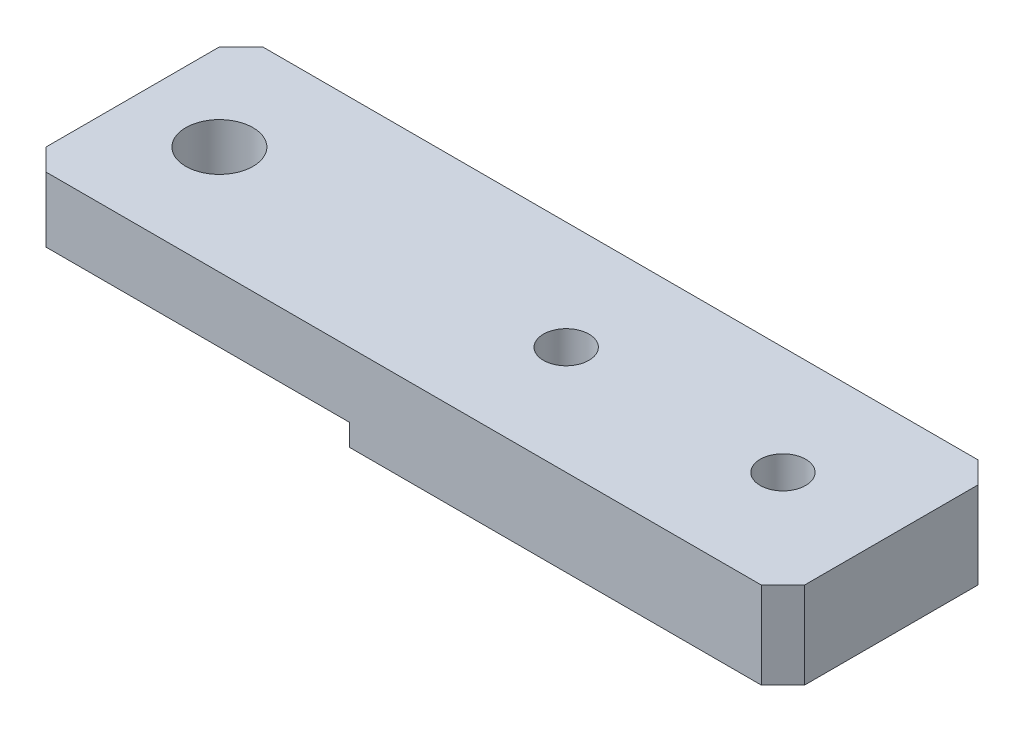
ISO-10303-21;
HEADER;
FILE_DESCRIPTION(('STEP AP214'),'2;1');
FILE_NAME('part.step','',(''),(''),'','','');
FILE_SCHEMA(('AUTOMOTIVE_DESIGN { 1 0 10303 214 1 1 1 1 }'));
ENDSEC;
DATA;
#1=APPLICATION_CONTEXT('core data for automotive mechanical design processes');
#2=APPLICATION_PROTOCOL_DEFINITION('international standard','automotive_design',2000,#1);
#3=PRODUCT_CONTEXT('',#1,'mechanical');
#4=PRODUCT('Part','Part','',(#3));
#5=PRODUCT_RELATED_PRODUCT_CATEGORY('part','',(#4));
#6=PRODUCT_DEFINITION_FORMATION('','',#4);
#7=PRODUCT_DEFINITION_CONTEXT('part definition',#1,'design');
#8=PRODUCT_DEFINITION('design','',#6,#7);
#9=PRODUCT_DEFINITION_SHAPE('','',#8);
#10=(LENGTH_UNIT() NAMED_UNIT(*) SI_UNIT(.MILLI.,.METRE.));
#11=(NAMED_UNIT(*) PLANE_ANGLE_UNIT() SI_UNIT($,.RADIAN.));
#12=(NAMED_UNIT(*) SI_UNIT($,.STERADIAN.) SOLID_ANGLE_UNIT());
#13=UNCERTAINTY_MEASURE_WITH_UNIT(LENGTH_MEASURE(1.E-05),#10,'distance_accuracy_value','');
#14=(GEOMETRIC_REPRESENTATION_CONTEXT(3) GLOBAL_UNCERTAINTY_ASSIGNED_CONTEXT((#13)) GLOBAL_UNIT_ASSIGNED_CONTEXT((#10,
#11,#12)) REPRESENTATION_CONTEXT('',''));
#15=CARTESIAN_POINT('',(0.,0.,0.));
#16=DIRECTION('',(0.,0.,1.));
#17=DIRECTION('',(1.,0.,0.));
#18=AXIS2_PLACEMENT_3D('',#15,#16,#17);
#19=CARTESIAN_POINT('',(0.,10.,10.));
#20=DIRECTION('',(0.,-1.,0.));
#21=DIRECTION('',(1.,0.,0.));
#22=AXIS2_PLACEMENT_3D('',#19,#20,#21);
#23=PLANE('',#22);
#24=CARTESIAN_POINT('',(8.,10.,0.));
#25=DIRECTION('',(0.,-1.,0.));
#26=DIRECTION('',(1.,0.,0.));
#27=AXIS2_PLACEMENT_3D('',#24,#25,#26);
#28=CIRCLE('',#27,3.1);
#29=CARTESIAN_POINT('',(11.1,10.,0.));
#30=VERTEX_POINT('',#29);
#31=EDGE_CURVE('E321',#30,#30,#28,.T.);
#32=ORIENTED_EDGE('',*,*,#31,.T.);
#33=EDGE_LOOP('',(#32));
#34=FACE_BOUND('',#33,.T.);
#35=CARTESIAN_POINT('',(60.,10.,0.));
#36=DIRECTION('',(0.,-1.,0.));
#37=DIRECTION('',(1.,0.,0.));
#38=AXIS2_PLACEMENT_3D('',#35,#36,#37);
#39=CIRCLE('',#38,2.1);
#40=CARTESIAN_POINT('',(62.1,10.,0.));
#41=VERTEX_POINT('',#40);
#42=EDGE_CURVE('E313',#41,#41,#39,.T.);
#43=ORIENTED_EDGE('',*,*,#42,.T.);
#44=EDGE_LOOP('',(#43));
#45=FACE_BOUND('',#44,.T.);
#46=CARTESIAN_POINT('',(40.,10.,0.));
#47=DIRECTION('',(0.,-1.,0.));
#48=DIRECTION('',(1.,0.,0.));
#49=AXIS2_PLACEMENT_3D('',#46,#47,#48);
#50=CIRCLE('',#49,2.1);
#51=CARTESIAN_POINT('',(42.1,10.,0.));
#52=VERTEX_POINT('',#51);
#53=EDGE_CURVE('E308',#52,#52,#50,.T.);
#54=ORIENTED_EDGE('',*,*,#53,.T.);
#55=EDGE_LOOP('',(#54));
#56=FACE_BOUND('',#55,.T.);
#57=DIRECTION('',(0.,0.,-1.));
#58=VECTOR('',#57,1.);
#59=CARTESIAN_POINT('',(70.,10.,10.));
#60=LINE('',#59,#58);
#61=CARTESIAN_POINT('',(70.,10.,7.99999999999999));
#62=VERTEX_POINT('',#61);
#63=CARTESIAN_POINT('',(70.,10.,-8.00000000000001));
#64=VERTEX_POINT('',#63);
#65=EDGE_CURVE('E153',#62,#64,#60,.T.);
#66=ORIENTED_EDGE('',*,*,#65,.T.);
#67=DIRECTION('',(-0.70710678118655,0.,-0.707106781186545));
#68=VECTOR('',#67,1.);
#69=CARTESIAN_POINT('',(70.,10.,-8.00000000000001));
#70=LINE('',#69,#68);
#71=CARTESIAN_POINT('',(68.,10.,-10.));
#72=VERTEX_POINT('',#71);
#73=EDGE_CURVE('E220',#64,#72,#70,.T.);
#74=ORIENTED_EDGE('',*,*,#73,.T.);
#75=DIRECTION('',(-1.,0.,0.));
#76=VECTOR('',#75,1.);
#77=CARTESIAN_POINT('',(0.,10.,-10.));
#78=LINE('',#77,#76);
#79=CARTESIAN_POINT('',(2.,10.,-10.));
#80=VERTEX_POINT('',#79);
#81=EDGE_CURVE('E157',#72,#80,#78,.T.);
#82=ORIENTED_EDGE('',*,*,#81,.T.);
#83=DIRECTION('',(-0.70710678118655,0.,0.707106781186545));
#84=VECTOR('',#83,1.);
#85=CARTESIAN_POINT('',(0.,10.,-8.00000000000001));
#86=LINE('',#85,#84);
#87=CARTESIAN_POINT('',(0.,10.,-8.00000000000001));
#88=VERTEX_POINT('',#87);
#89=EDGE_CURVE('E205',#80,#88,#86,.T.);
#90=ORIENTED_EDGE('',*,*,#89,.T.);
#91=DIRECTION('',(0.,0.,-1.));
#92=VECTOR('',#91,1.);
#93=CARTESIAN_POINT('',(0.,10.,10.));
#94=LINE('',#93,#92);
#95=CARTESIAN_POINT('',(0.,10.,8.));
#96=VERTEX_POINT('',#95);
#97=EDGE_CURVE('E180',#96,#88,#94,.T.);
#98=ORIENTED_EDGE('',*,*,#97,.F.);
#99=DIRECTION('',(-0.707106781186545,0.,-0.70710678118655));
#100=VECTOR('',#99,1.);
#101=CARTESIAN_POINT('',(1.99999999999999,10.,10.));
#102=LINE('',#101,#100);
#103=CARTESIAN_POINT('',(1.99999999999999,10.,10.));
#104=VERTEX_POINT('',#103);
#105=EDGE_CURVE('E201',#96,#104,#102,.F.);
#106=ORIENTED_EDGE('',*,*,#105,.T.);
#107=DIRECTION('',(-1.,0.,0.));
#108=VECTOR('',#107,1.);
#109=CARTESIAN_POINT('',(0.,10.,10.));
#110=LINE('',#109,#108);
#111=CARTESIAN_POINT('',(68.,10.,10.));
#112=VERTEX_POINT('',#111);
#113=EDGE_CURVE('E133',#112,#104,#110,.T.);
#114=ORIENTED_EDGE('',*,*,#113,.F.);
#115=DIRECTION('',(-0.707106781186546,0.,0.707106781186549));
#116=VECTOR('',#115,1.);
#117=CARTESIAN_POINT('',(68.,10.,10.));
#118=LINE('',#117,#116);
#119=EDGE_CURVE('E217',#112,#62,#118,.F.);
#120=ORIENTED_EDGE('',*,*,#119,.T.);
#121=EDGE_LOOP('',(#66,#74,#82,#90,#98,#106,#114,#120));
#122=FACE_BOUND('',#121,.T.);
#123=ADVANCED_FACE('F41',(#34,#45,#56,#122),#23,.F.);
#124=CARTESIAN_POINT('',(0.,4.,10.));
#125=DIRECTION('',(1.,0.,0.));
#126=DIRECTION('',(0.,1.,0.));
#127=AXIS2_PLACEMENT_3D('',#124,#125,#126);
#128=PLANE('',#127);
#129=ORIENTED_EDGE('',*,*,#97,.T.);
#130=DIRECTION('',(0.,-1.,0.));
#131=VECTOR('',#130,1.);
#132=CARTESIAN_POINT('',(0.,4.,-8.00000000000001));
#133=LINE('',#132,#131);
#134=CARTESIAN_POINT('',(0.,4.,-8.00000000000001));
#135=VERTEX_POINT('',#134);
#136=EDGE_CURVE('E187',#88,#135,#133,.T.);
#137=ORIENTED_EDGE('',*,*,#136,.T.);
#138=DIRECTION('',(0.,0.,-1.));
#139=VECTOR('',#138,1.);
#140=CARTESIAN_POINT('',(0.,4.,10.));
#141=LINE('',#140,#139);
#142=CARTESIAN_POINT('',(0.,4.,8.));
#143=VERTEX_POINT('',#142);
#144=EDGE_CURVE('E144',#143,#135,#141,.T.);
#145=ORIENTED_EDGE('',*,*,#144,.F.);
#146=DIRECTION('',(0.,1.,0.));
#147=VECTOR('',#146,1.);
#148=CARTESIAN_POINT('',(0.,4.,8.));
#149=LINE('',#148,#147);
#150=EDGE_CURVE('E184',#143,#96,#149,.T.);
#151=ORIENTED_EDGE('',*,*,#150,.T.);
#152=EDGE_LOOP('',(#129,#137,#145,#151));
#153=FACE_BOUND('',#152,.T.);
#154=ADVANCED_FACE('F251',(#153),#128,.F.);
#155=CARTESIAN_POINT('',(0.,4.,10.));
#156=DIRECTION('',(0.,1.,0.));
#157=DIRECTION('',(0.,0.,1.));
#158=AXIS2_PLACEMENT_3D('',#155,#156,#157);
#159=PLANE('',#158);
#160=CARTESIAN_POINT('',(8.,4.,0.));
#161=DIRECTION('',(0.,1.,0.));
#162=DIRECTION('',(0.,0.,1.));
#163=AXIS2_PLACEMENT_3D('',#160,#161,#162);
#164=CIRCLE('',#163,6.);
#165=CARTESIAN_POINT('',(8.,4.,6.));
#166=VERTEX_POINT('',#165);
#167=EDGE_CURVE('E11',#166,#166,#164,.T.);
#168=ORIENTED_EDGE('',*,*,#167,.T.);
#169=EDGE_LOOP('',(#168));
#170=FACE_BOUND('',#169,.T.);
#171=ORIENTED_EDGE('',*,*,#144,.T.);
#172=DIRECTION('',(0.70710678118655,0.,-0.707106781186545));
#173=VECTOR('',#172,1.);
#174=CARTESIAN_POINT('',(0.,4.,-8.00000000000001));
#175=LINE('',#174,#173);
#176=CARTESIAN_POINT('',(2.,4.,-10.));
#177=VERTEX_POINT('',#176);
#178=EDGE_CURVE('E194',#135,#177,#175,.T.);
#179=ORIENTED_EDGE('',*,*,#178,.T.);
#180=DIRECTION('',(1.,0.,0.));
#181=VECTOR('',#180,1.);
#182=CARTESIAN_POINT('',(0.,4.,-10.));
#183=LINE('',#182,#181);
#184=CARTESIAN_POINT('',(30.,4.,-10.));
#185=VERTEX_POINT('',#184);
#186=EDGE_CURVE('E140',#177,#185,#183,.T.);
#187=ORIENTED_EDGE('',*,*,#186,.T.);
#188=DIRECTION('',(0.,0.,-1.));
#189=VECTOR('',#188,1.);
#190=CARTESIAN_POINT('',(30.,4.,10.));
#191=LINE('',#190,#189);
#192=CARTESIAN_POINT('',(30.,4.,10.));
#193=VERTEX_POINT('',#192);
#194=EDGE_CURVE('E136',#193,#185,#191,.T.);
#195=ORIENTED_EDGE('',*,*,#194,.F.);
#196=DIRECTION('',(1.,0.,0.));
#197=VECTOR('',#196,1.);
#198=CARTESIAN_POINT('',(0.,4.,10.));
#199=LINE('',#198,#197);
#200=CARTESIAN_POINT('',(1.99999999999999,4.,10.));
#201=VERTEX_POINT('',#200);
#202=EDGE_CURVE('E123',#201,#193,#199,.T.);
#203=ORIENTED_EDGE('',*,*,#202,.F.);
#204=DIRECTION('',(0.707106781186545,0.,0.70710678118655));
#205=VECTOR('',#204,1.);
#206=CARTESIAN_POINT('',(1.99999999999999,4.,10.));
#207=LINE('',#206,#205);
#208=EDGE_CURVE('E191',#201,#143,#207,.F.);
#209=ORIENTED_EDGE('',*,*,#208,.T.);
#210=EDGE_LOOP('',(#171,#179,#187,#195,#203,#209));
#211=FACE_BOUND('',#210,.T.);
#212=ADVANCED_FACE('F138',(#170,#211),#159,.F.);
#213=CARTESIAN_POINT('',(30.,4.,10.));
#214=DIRECTION('',(1.,0.,0.));
#215=DIRECTION('',(0.,0.,-1.));
#216=AXIS2_PLACEMENT_3D('',#213,#214,#215);
#217=PLANE('',#216);
#218=DIRECTION('',(0.,-1.,0.));
#219=VECTOR('',#218,1.);
#220=CARTESIAN_POINT('',(30.,4.,-10.));
#221=LINE('',#220,#219);
#222=CARTESIAN_POINT('',(30.,2.,-10.));
#223=VERTEX_POINT('',#222);
#224=EDGE_CURVE('E163',#185,#223,#221,.T.);
#225=ORIENTED_EDGE('',*,*,#224,.T.);
#226=DIRECTION('',(0.,0.,-1.));
#227=VECTOR('',#226,1.);
#228=CARTESIAN_POINT('',(30.,2.,10.));
#229=LINE('',#228,#227);
#230=CARTESIAN_POINT('',(30.,2.,10.));
#231=VERTEX_POINT('',#230);
#232=EDGE_CURVE('E145',#231,#223,#229,.T.);
#233=ORIENTED_EDGE('',*,*,#232,.F.);
#234=DIRECTION('',(0.,-1.,0.));
#235=VECTOR('',#234,1.);
#236=CARTESIAN_POINT('',(30.,4.,10.));
#237=LINE('',#236,#235);
#238=EDGE_CURVE('E127',#193,#231,#237,.T.);
#239=ORIENTED_EDGE('',*,*,#238,.F.);
#240=ORIENTED_EDGE('',*,*,#194,.T.);
#241=EDGE_LOOP('',(#225,#233,#239,#240));
#242=FACE_BOUND('',#241,.T.);
#243=ADVANCED_FACE('F147',(#242),#217,.F.);
#244=CARTESIAN_POINT('',(70.,2.,10.));
#245=DIRECTION('',(0.,1.,0.));
#246=DIRECTION('',(-1.,0.,0.));
#247=AXIS2_PLACEMENT_3D('',#244,#245,#246);
#248=PLANE('',#247);
#249=CARTESIAN_POINT('',(60.,2.,0.));
#250=DIRECTION('',(0.,-1.,0.));
#251=DIRECTION('',(1.,0.,0.));
#252=AXIS2_PLACEMENT_3D('',#249,#250,#251);
#253=CIRCLE('',#252,2.1);
#254=CARTESIAN_POINT('',(62.1,2.,0.));
#255=VERTEX_POINT('',#254);
#256=EDGE_CURVE('E324',#255,#255,#253,.T.);
#257=ORIENTED_EDGE('',*,*,#256,.F.);
#258=EDGE_LOOP('',(#257));
#259=FACE_BOUND('',#258,.T.);
#260=CARTESIAN_POINT('',(40.,2.,0.));
#261=DIRECTION('',(0.,-1.,0.));
#262=DIRECTION('',(1.,0.,0.));
#263=AXIS2_PLACEMENT_3D('',#260,#261,#262);
#264=CIRCLE('',#263,2.1);
#265=CARTESIAN_POINT('',(42.1,2.,0.));
#266=VERTEX_POINT('',#265);
#267=EDGE_CURVE('E309',#266,#266,#264,.T.);
#268=ORIENTED_EDGE('',*,*,#267,.F.);
#269=EDGE_LOOP('',(#268));
#270=FACE_BOUND('',#269,.T.);
#271=DIRECTION('',(1.,0.,0.));
#272=VECTOR('',#271,1.);
#273=CARTESIAN_POINT('',(70.,2.,-10.));
#274=LINE('',#273,#272);
#275=CARTESIAN_POINT('',(68.,2.,-10.));
#276=VERTEX_POINT('',#275);
#277=EDGE_CURVE('E166',#223,#276,#274,.T.);
#278=ORIENTED_EDGE('',*,*,#277,.T.);
#279=DIRECTION('',(0.70710678118655,0.,0.707106781186545));
#280=VECTOR('',#279,1.);
#281=CARTESIAN_POINT('',(70.,2.,-8.00000000000001));
#282=LINE('',#281,#280);
#283=CARTESIAN_POINT('',(70.,2.,-8.00000000000001));
#284=VERTEX_POINT('',#283);
#285=EDGE_CURVE('E227',#276,#284,#282,.T.);
#286=ORIENTED_EDGE('',*,*,#285,.T.);
#287=DIRECTION('',(0.,0.,-1.));
#288=VECTOR('',#287,1.);
#289=CARTESIAN_POINT('',(70.,2.,10.));
#290=LINE('',#289,#288);
#291=CARTESIAN_POINT('',(70.,2.,7.99999999999999));
#292=VERTEX_POINT('',#291);
#293=EDGE_CURVE('E172',#292,#284,#290,.T.);
#294=ORIENTED_EDGE('',*,*,#293,.F.);
#295=DIRECTION('',(0.707106781186546,0.,-0.707106781186549));
#296=VECTOR('',#295,1.);
#297=CARTESIAN_POINT('',(68.,2.,10.));
#298=LINE('',#297,#296);
#299=CARTESIAN_POINT('',(68.,2.,10.));
#300=VERTEX_POINT('',#299);
#301=EDGE_CURVE('E57',#292,#300,#298,.F.);
#302=ORIENTED_EDGE('',*,*,#301,.T.);
#303=DIRECTION('',(1.,0.,0.));
#304=VECTOR('',#303,1.);
#305=CARTESIAN_POINT('',(70.,2.,10.));
#306=LINE('',#305,#304);
#307=EDGE_CURVE('E150',#231,#300,#306,.T.);
#308=ORIENTED_EDGE('',*,*,#307,.F.);
#309=ORIENTED_EDGE('',*,*,#232,.T.);
#310=EDGE_LOOP('',(#278,#286,#294,#302,#308,#309));
#311=FACE_BOUND('',#310,.T.);
#312=ADVANCED_FACE('F335',(#259,#270,#311),#248,.F.);
#313=CARTESIAN_POINT('',(70.,10.,10.));
#314=DIRECTION('',(-1.,0.,0.));
#315=DIRECTION('',(0.,0.,1.));
#316=AXIS2_PLACEMENT_3D('',#313,#314,#315);
#317=PLANE('',#316);
#318=ORIENTED_EDGE('',*,*,#293,.T.);
#319=DIRECTION('',(0.,1.,0.));
#320=VECTOR('',#319,1.);
#321=CARTESIAN_POINT('',(70.,10.,-8.00000000000001));
#322=LINE('',#321,#320);
#323=EDGE_CURVE('E213',#284,#64,#322,.T.);
#324=ORIENTED_EDGE('',*,*,#323,.T.);
#325=ORIENTED_EDGE('',*,*,#65,.F.);
#326=DIRECTION('',(0.,-1.,0.));
#327=VECTOR('',#326,1.);
#328=CARTESIAN_POINT('',(70.,10.,7.99999999999999));
#329=LINE('',#328,#327);
#330=EDGE_CURVE('E210',#62,#292,#329,.T.);
#331=ORIENTED_EDGE('',*,*,#330,.T.);
#332=EDGE_LOOP('',(#318,#324,#325,#331));
#333=FACE_BOUND('',#332,.T.);
#334=ADVANCED_FACE('F338',(#333),#317,.F.);
#335=CARTESIAN_POINT('',(0.,0.,10.));
#336=DIRECTION('',(0.,0.,-1.));
#337=DIRECTION('',(-1.,0.,0.));
#338=AXIS2_PLACEMENT_3D('',#335,#336,#337);
#339=PLANE('',#338);
#340=ORIENTED_EDGE('',*,*,#307,.T.);
#341=DIRECTION('',(0.,1.,0.));
#342=VECTOR('',#341,1.);
#343=CARTESIAN_POINT('',(68.,0.,10.));
#344=LINE('',#343,#342);
#345=EDGE_CURVE('E230',#300,#112,#344,.T.);
#346=ORIENTED_EDGE('',*,*,#345,.T.);
#347=ORIENTED_EDGE('',*,*,#113,.T.);
#348=DIRECTION('',(0.,-1.,0.));
#349=VECTOR('',#348,1.);
#350=CARTESIAN_POINT('',(1.99999999999999,0.,10.));
#351=LINE('',#350,#349);
#352=EDGE_CURVE('E130',#104,#201,#351,.T.);
#353=ORIENTED_EDGE('',*,*,#352,.T.);
#354=ORIENTED_EDGE('',*,*,#202,.T.);
#355=ORIENTED_EDGE('',*,*,#238,.T.);
#356=EDGE_LOOP('',(#340,#346,#347,#353,#354,#355));
#357=FACE_BOUND('',#356,.T.);
#358=ADVANCED_FACE('F125',(#357),#339,.F.);
#359=CARTESIAN_POINT('',(0.,0.,-10.));
#360=DIRECTION('',(0.,0.,-1.));
#361=DIRECTION('',(-1.,0.,0.));
#362=AXIS2_PLACEMENT_3D('',#359,#360,#361);
#363=PLANE('',#362);
#364=ORIENTED_EDGE('',*,*,#81,.F.);
#365=DIRECTION('',(0.,-1.,0.));
#366=VECTOR('',#365,1.);
#367=CARTESIAN_POINT('',(68.,2.,-10.));
#368=LINE('',#367,#366);
#369=EDGE_CURVE('E65',#72,#276,#368,.T.);
#370=ORIENTED_EDGE('',*,*,#369,.T.);
#371=ORIENTED_EDGE('',*,*,#277,.F.);
#372=ORIENTED_EDGE('',*,*,#224,.F.);
#373=ORIENTED_EDGE('',*,*,#186,.F.);
#374=DIRECTION('',(0.,1.,0.));
#375=VECTOR('',#374,1.);
#376=CARTESIAN_POINT('',(2.,10.,-10.));
#377=LINE('',#376,#375);
#378=EDGE_CURVE('E197',#177,#80,#377,.T.);
#379=ORIENTED_EDGE('',*,*,#378,.T.);
#380=EDGE_LOOP('',(#364,#370,#371,#372,#373,#379));
#381=FACE_BOUND('',#380,.T.);
#382=ADVANCED_FACE('F344',(#381),#363,.T.);
#383=CARTESIAN_POINT('',(8.,2.,0.));
#384=DIRECTION('',(0.,1.,0.));
#385=DIRECTION('',(0.,0.,1.));
#386=AXIS2_PLACEMENT_3D('',#383,#384,#385);
#387=CYLINDRICAL_SURFACE('',#386,5.);
#388=CARTESIAN_POINT('',(8.,3.,0.));
#389=DIRECTION('',(0.,1.,0.));
#390=DIRECTION('',(0.,0.,1.));
#391=AXIS2_PLACEMENT_3D('',#388,#389,#390);
#392=CIRCLE('',#391,5.);
#393=CARTESIAN_POINT('',(8.,3.,5.));
#394=VERTEX_POINT('',#393);
#395=EDGE_CURVE('E50',#394,#394,#392,.F.);
#396=ORIENTED_EDGE('',*,*,#395,.T.);
#397=EDGE_LOOP('',(#396));
#398=FACE_BOUND('',#397,.T.);
#399=CARTESIAN_POINT('',(8.,2.,0.));
#400=DIRECTION('',(0.,-1.,0.));
#401=DIRECTION('',(0.,0.,-1.));
#402=AXIS2_PLACEMENT_3D('',#399,#400,#401);
#403=CIRCLE('',#402,5.);
#404=CARTESIAN_POINT('',(8.,2.,-5.));
#405=VERTEX_POINT('',#404);
#406=EDGE_CURVE('E160',#405,#405,#403,.T.);
#407=ORIENTED_EDGE('',*,*,#406,.F.);
#408=EDGE_LOOP('',(#407));
#409=FACE_BOUND('',#408,.T.);
#410=ADVANCED_FACE('F237',(#398,#409),#387,.T.);
#411=CARTESIAN_POINT('',(8.,2.,0.));
#412=DIRECTION('',(0.,-1.,0.));
#413=DIRECTION('',(0.,0.,-1.));
#414=AXIS2_PLACEMENT_3D('',#411,#412,#413);
#415=PLANE('',#414);
#416=CARTESIAN_POINT('',(8.,1.99999999999999,0.));
#417=DIRECTION('',(0.,-1.,0.));
#418=DIRECTION('',(1.,0.,0.));
#419=AXIS2_PLACEMENT_3D('',#416,#417,#418);
#420=CIRCLE('',#419,3.1);
#421=CARTESIAN_POINT('',(11.1,1.99999999999999,0.));
#422=VERTEX_POINT('',#421);
#423=EDGE_CURVE('E317',#422,#422,#420,.T.);
#424=ORIENTED_EDGE('',*,*,#423,.F.);
#425=EDGE_LOOP('',(#424));
#426=FACE_BOUND('',#425,.T.);
#427=ORIENTED_EDGE('',*,*,#406,.T.);
#428=EDGE_LOOP('',(#427));
#429=FACE_BOUND('',#428,.T.);
#430=ADVANCED_FACE('F271',(#426,#429),#415,.T.);
#431=CARTESIAN_POINT('',(0.,4.,-8.00000000000001));
#432=DIRECTION('',(-0.707106781186545,0.,-0.70710678118655));
#433=DIRECTION('',(0.,1.,0.));
#434=AXIS2_PLACEMENT_3D('',#431,#432,#433);
#435=PLANE('',#434);
#436=ORIENTED_EDGE('',*,*,#89,.F.);
#437=ORIENTED_EDGE('',*,*,#378,.F.);
#438=ORIENTED_EDGE('',*,*,#178,.F.);
#439=ORIENTED_EDGE('',*,*,#136,.F.);
#440=EDGE_LOOP('',(#436,#437,#438,#439));
#441=FACE_BOUND('',#440,.T.);
#442=ADVANCED_FACE('F264',(#441),#435,.T.);
#443=CARTESIAN_POINT('',(1.99999999999999,0.,10.));
#444=DIRECTION('',(0.70710678118655,0.,-0.707106781186545));
#445=DIRECTION('',(0.,-1.,0.));
#446=AXIS2_PLACEMENT_3D('',#443,#444,#445);
#447=PLANE('',#446);
#448=ORIENTED_EDGE('',*,*,#105,.F.);
#449=ORIENTED_EDGE('',*,*,#150,.F.);
#450=ORIENTED_EDGE('',*,*,#208,.F.);
#451=ORIENTED_EDGE('',*,*,#352,.F.);
#452=EDGE_LOOP('',(#448,#449,#450,#451));
#453=FACE_BOUND('',#452,.T.);
#454=ADVANCED_FACE('F270',(#453),#447,.F.);
#455=CARTESIAN_POINT('',(70.,10.,-8.00000000000001));
#456=DIRECTION('',(0.707106781186545,0.,-0.70710678118655));
#457=DIRECTION('',(0.,-1.,0.));
#458=AXIS2_PLACEMENT_3D('',#455,#456,#457);
#459=PLANE('',#458);
#460=ORIENTED_EDGE('',*,*,#285,.F.);
#461=ORIENTED_EDGE('',*,*,#369,.F.);
#462=ORIENTED_EDGE('',*,*,#73,.F.);
#463=ORIENTED_EDGE('',*,*,#323,.F.);
#464=EDGE_LOOP('',(#460,#461,#462,#463));
#465=FACE_BOUND('',#464,.T.);
#466=ADVANCED_FACE('F278',(#465),#459,.T.);
#467=CARTESIAN_POINT('',(68.,0.,10.));
#468=DIRECTION('',(-0.707106781186549,0.,-0.707106781186546));
#469=DIRECTION('',(0.,1.,0.));
#470=AXIS2_PLACEMENT_3D('',#467,#468,#469);
#471=PLANE('',#470);
#472=ORIENTED_EDGE('',*,*,#301,.F.);
#473=ORIENTED_EDGE('',*,*,#330,.F.);
#474=ORIENTED_EDGE('',*,*,#119,.F.);
#475=ORIENTED_EDGE('',*,*,#345,.F.);
#476=EDGE_LOOP('',(#472,#473,#474,#475));
#477=FACE_BOUND('',#476,.T.);
#478=ADVANCED_FACE('F284',(#477),#471,.F.);
#479=CARTESIAN_POINT('',(8.,10.,0.));
#480=DIRECTION('',(0.,-1.,0.));
#481=DIRECTION('',(1.,0.,0.));
#482=AXIS2_PLACEMENT_3D('',#479,#480,#481);
#483=CYLINDRICAL_SURFACE('',#482,3.1);
#484=ORIENTED_EDGE('',*,*,#31,.F.);
#485=EDGE_LOOP('',(#484));
#486=FACE_BOUND('',#485,.T.);
#487=ORIENTED_EDGE('',*,*,#423,.T.);
#488=EDGE_LOOP('',(#487));
#489=FACE_BOUND('',#488,.T.);
#490=ADVANCED_FACE('F289',(#486,#489),#483,.F.);
#491=CARTESIAN_POINT('',(40.,10.,0.));
#492=DIRECTION('',(0.,-1.,0.));
#493=DIRECTION('',(1.,0.,0.));
#494=AXIS2_PLACEMENT_3D('',#491,#492,#493);
#495=CYLINDRICAL_SURFACE('',#494,2.1);
#496=ORIENTED_EDGE('',*,*,#53,.F.);
#497=EDGE_LOOP('',(#496));
#498=FACE_BOUND('',#497,.T.);
#499=ORIENTED_EDGE('',*,*,#267,.T.);
#500=EDGE_LOOP('',(#499));
#501=FACE_BOUND('',#500,.T.);
#502=ADVANCED_FACE('F246',(#498,#501),#495,.F.);
#503=CARTESIAN_POINT('',(60.,10.,0.));
#504=DIRECTION('',(0.,-1.,0.));
#505=DIRECTION('',(1.,0.,0.));
#506=AXIS2_PLACEMENT_3D('',#503,#504,#505);
#507=CYLINDRICAL_SURFACE('',#506,2.1);
#508=ORIENTED_EDGE('',*,*,#42,.F.);
#509=EDGE_LOOP('',(#508));
#510=FACE_BOUND('',#509,.T.);
#511=ORIENTED_EDGE('',*,*,#256,.T.);
#512=EDGE_LOOP('',(#511));
#513=FACE_BOUND('',#512,.T.);
#514=ADVANCED_FACE('F241',(#510,#513),#507,.F.);
#515=CARTESIAN_POINT('',(8.,3.,0.));
#516=DIRECTION('',(0.,1.,0.));
#517=DIRECTION('',(0.,0.,1.));
#518=AXIS2_PLACEMENT_3D('',#515,#516,#517);
#519=TOROIDAL_SURFACE('',#518,6.,1.);
#520=ORIENTED_EDGE('',*,*,#167,.F.);
#521=EDGE_LOOP('',(#520));
#522=FACE_BOUND('',#521,.T.);
#523=ORIENTED_EDGE('',*,*,#395,.F.);
#524=EDGE_LOOP('',(#523));
#525=FACE_BOUND('',#524,.T.);
#526=ADVANCED_FACE('F43',(#522,#525),#519,.F.);
#527=CLOSED_SHELL('',(#123,#154,#212,#243,#312,#334,#358,#382,#410,#430,#442,#454,#466,#478,
#490,#502,#514,#526));
#528=MANIFOLD_SOLID_BREP('B2',#527);
#529=ADVANCED_BREP_SHAPE_REPRESENTATION('',(#18,#528),#14);
#530=SHAPE_DEFINITION_REPRESENTATION(#9,#529);
ENDSEC;
END-ISO-10303-21;
